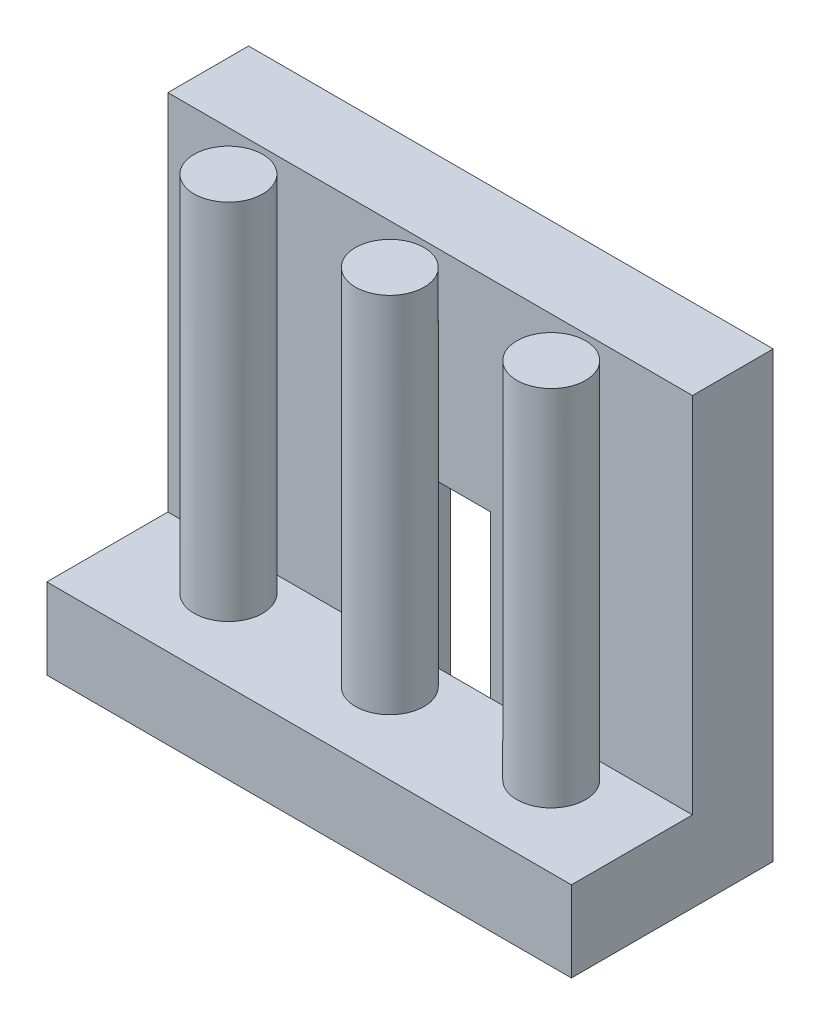
ISO-10303-21;
HEADER;
FILE_DESCRIPTION(('STEP AP214'),'2;1');
FILE_NAME('part.step','',(''),(''),'','','');
FILE_SCHEMA(('AUTOMOTIVE_DESIGN { 1 0 10303 214 1 1 1 1 }'));
ENDSEC;
DATA;
#1=APPLICATION_CONTEXT('core data for automotive mechanical design processes');
#2=APPLICATION_PROTOCOL_DEFINITION('international standard','automotive_design',2000,#1);
#3=PRODUCT_CONTEXT('',#1,'mechanical');
#4=PRODUCT('Part','Part','',(#3));
#5=PRODUCT_RELATED_PRODUCT_CATEGORY('part','',(#4));
#6=PRODUCT_DEFINITION_FORMATION('','',#4);
#7=PRODUCT_DEFINITION_CONTEXT('part definition',#1,'design');
#8=PRODUCT_DEFINITION('design','',#6,#7);
#9=PRODUCT_DEFINITION_SHAPE('','',#8);
#10=(LENGTH_UNIT() NAMED_UNIT(*) SI_UNIT(.MILLI.,.METRE.));
#11=(NAMED_UNIT(*) PLANE_ANGLE_UNIT() SI_UNIT($,.RADIAN.));
#12=(NAMED_UNIT(*) SI_UNIT($,.STERADIAN.) SOLID_ANGLE_UNIT());
#13=UNCERTAINTY_MEASURE_WITH_UNIT(LENGTH_MEASURE(1.E-05),#10,'distance_accuracy_value','');
#14=(GEOMETRIC_REPRESENTATION_CONTEXT(3) GLOBAL_UNCERTAINTY_ASSIGNED_CONTEXT((#13)) GLOBAL_UNIT_ASSIGNED_CONTEXT((#10,
#11,#12)) REPRESENTATION_CONTEXT('',''));
#15=CARTESIAN_POINT('',(0.,0.,0.));
#16=DIRECTION('',(0.,0.,1.));
#17=DIRECTION('',(1.,0.,0.));
#18=AXIS2_PLACEMENT_3D('',#15,#16,#17);
#19=CARTESIAN_POINT('',(0.,11.,0.));
#20=DIRECTION('',(1.,0.,0.));
#21=DIRECTION('',(0.,0.,-1.));
#22=AXIS2_PLACEMENT_3D('',#19,#20,#21);
#23=PLANE('',#22);
#24=DIRECTION('',(0.,0.,1.));
#25=VECTOR('',#24,1.);
#26=CARTESIAN_POINT('',(0.,2.,-3.));
#27=LINE('',#26,#25);
#28=CARTESIAN_POINT('',(0.,2.,-3.));
#29=VERTEX_POINT('',#28);
#30=CARTESIAN_POINT('',(0.,2.,0.));
#31=VERTEX_POINT('',#30);
#32=EDGE_CURVE('E186',#29,#31,#27,.T.);
#33=ORIENTED_EDGE('',*,*,#32,.F.);
#34=DIRECTION('',(0.,1.,0.));
#35=VECTOR('',#34,1.);
#36=CARTESIAN_POINT('',(0.,2.,-3.));
#37=LINE('',#36,#35);
#38=CARTESIAN_POINT('',(0.,11.,-3.));
#39=VERTEX_POINT('',#38);
#40=EDGE_CURVE('E196',#29,#39,#37,.T.);
#41=ORIENTED_EDGE('',*,*,#40,.T.);
#42=DIRECTION('',(0.,0.,1.));
#43=VECTOR('',#42,1.);
#44=CARTESIAN_POINT('',(0.,11.,0.));
#45=LINE('',#44,#43);
#46=CARTESIAN_POINT('',(0.,11.,-5.));
#47=VERTEX_POINT('',#46);
#48=EDGE_CURVE('E203',#47,#39,#45,.T.);
#49=ORIENTED_EDGE('',*,*,#48,.F.);
#50=DIRECTION('',(0.,-1.,0.));
#51=VECTOR('',#50,1.);
#52=CARTESIAN_POINT('',(0.,11.,-5.));
#53=LINE('',#52,#51);
#54=CARTESIAN_POINT('',(0.,0.,-5.));
#55=VERTEX_POINT('',#54);
#56=EDGE_CURVE('E214',#47,#55,#53,.T.);
#57=ORIENTED_EDGE('',*,*,#56,.T.);
#58=DIRECTION('',(0.,0.,1.));
#59=VECTOR('',#58,1.);
#60=CARTESIAN_POINT('',(0.,0.,0.));
#61=LINE('',#60,#59);
#62=CARTESIAN_POINT('',(0.,0.,0.));
#63=VERTEX_POINT('',#62);
#64=EDGE_CURVE('E200',#55,#63,#61,.T.);
#65=ORIENTED_EDGE('',*,*,#64,.T.);
#66=DIRECTION('',(0.,-1.,0.));
#67=VECTOR('',#66,1.);
#68=CARTESIAN_POINT('',(0.,11.,0.));
#69=LINE('',#68,#67);
#70=EDGE_CURVE('E239',#31,#63,#69,.T.);
#71=ORIENTED_EDGE('',*,*,#70,.F.);
#72=EDGE_LOOP('',(#33,#41,#49,#57,#65,#71));
#73=FACE_BOUND('',#72,.T.);
#74=ADVANCED_FACE('F39',(#73),#23,.F.);
#75=CARTESIAN_POINT('',(0.,11.,0.));
#76=DIRECTION('',(0.,0.,-1.));
#77=DIRECTION('',(-1.,0.,0.));
#78=AXIS2_PLACEMENT_3D('',#75,#76,#77);
#79=PLANE('',#78);
#80=DIRECTION('',(0.,-1.,0.));
#81=VECTOR('',#80,1.);
#82=CARTESIAN_POINT('',(13.,11.,0.));
#83=LINE('',#82,#81);
#84=CARTESIAN_POINT('',(13.,2.,0.));
#85=VERTEX_POINT('',#84);
#86=CARTESIAN_POINT('',(13.,0.,0.));
#87=VERTEX_POINT('',#86);
#88=EDGE_CURVE('E236',#85,#87,#83,.T.);
#89=ORIENTED_EDGE('',*,*,#88,.F.);
#90=DIRECTION('',(1.,0.,0.));
#91=VECTOR('',#90,1.);
#92=CARTESIAN_POINT('',(13.,2.,0.));
#93=LINE('',#92,#91);
#94=EDGE_CURVE('E190',#31,#85,#93,.T.);
#95=ORIENTED_EDGE('',*,*,#94,.F.);
#96=ORIENTED_EDGE('',*,*,#70,.T.);
#97=DIRECTION('',(1.,0.,0.));
#98=VECTOR('',#97,1.);
#99=CARTESIAN_POINT('',(0.,0.,0.));
#100=LINE('',#99,#98);
#101=EDGE_CURVE('E218',#63,#87,#100,.T.);
#102=ORIENTED_EDGE('',*,*,#101,.T.);
#103=EDGE_LOOP('',(#89,#95,#96,#102));
#104=FACE_BOUND('',#103,.T.);
#105=ADVANCED_FACE('F278',(#104),#79,.F.);
#106=CARTESIAN_POINT('',(13.,11.,0.));
#107=DIRECTION('',(-1.,0.,0.));
#108=DIRECTION('',(0.,0.,1.));
#109=AXIS2_PLACEMENT_3D('',#106,#107,#108);
#110=PLANE('',#109);
#111=DIRECTION('',(0.,0.,-1.));
#112=VECTOR('',#111,1.);
#113=CARTESIAN_POINT('',(13.,11.,0.));
#114=LINE('',#113,#112);
#115=CARTESIAN_POINT('',(13.,11.,-3.));
#116=VERTEX_POINT('',#115);
#117=CARTESIAN_POINT('',(13.,11.,-5.));
#118=VERTEX_POINT('',#117);
#119=EDGE_CURVE('E207',#116,#118,#114,.T.);
#120=ORIENTED_EDGE('',*,*,#119,.F.);
#121=DIRECTION('',(0.,1.,0.));
#122=VECTOR('',#121,1.);
#123=CARTESIAN_POINT('',(13.,2.,-3.));
#124=LINE('',#123,#122);
#125=CARTESIAN_POINT('',(13.,2.,-3.));
#126=VERTEX_POINT('',#125);
#127=EDGE_CURVE('E193',#126,#116,#124,.T.);
#128=ORIENTED_EDGE('',*,*,#127,.F.);
#129=DIRECTION('',(0.,0.,-1.));
#130=VECTOR('',#129,1.);
#131=CARTESIAN_POINT('',(13.,2.,-3.));
#132=LINE('',#131,#130);
#133=EDGE_CURVE('E178',#85,#126,#132,.T.);
#134=ORIENTED_EDGE('',*,*,#133,.F.);
#135=ORIENTED_EDGE('',*,*,#88,.T.);
#136=DIRECTION('',(0.,0.,-1.));
#137=VECTOR('',#136,1.);
#138=CARTESIAN_POINT('',(13.,0.,0.));
#139=LINE('',#138,#137);
#140=CARTESIAN_POINT('',(13.,0.,-5.));
#141=VERTEX_POINT('',#140);
#142=EDGE_CURVE('E222',#87,#141,#139,.T.);
#143=ORIENTED_EDGE('',*,*,#142,.T.);
#144=DIRECTION('',(0.,-1.,0.));
#145=VECTOR('',#144,1.);
#146=CARTESIAN_POINT('',(13.,11.,-5.));
#147=LINE('',#146,#145);
#148=EDGE_CURVE('E232',#118,#141,#147,.T.);
#149=ORIENTED_EDGE('',*,*,#148,.F.);
#150=EDGE_LOOP('',(#120,#128,#134,#135,#143,#149));
#151=FACE_BOUND('',#150,.T.);
#152=ADVANCED_FACE('F265',(#151),#110,.F.);
#153=CARTESIAN_POINT('',(0.,11.,-5.));
#154=DIRECTION('',(0.,0.,1.));
#155=DIRECTION('',(1.,0.,0.));
#156=AXIS2_PLACEMENT_3D('',#153,#154,#155);
#157=PLANE('',#156);
#158=DIRECTION('',(1.,0.,0.));
#159=VECTOR('',#158,1.);
#160=CARTESIAN_POINT('',(5.,6.,-5.));
#161=LINE('',#160,#159);
#162=CARTESIAN_POINT('',(5.,6.,-5.));
#163=VERTEX_POINT('',#162);
#164=CARTESIAN_POINT('',(8.,6.,-5.));
#165=VERTEX_POINT('',#164);
#166=EDGE_CURVE('E155',#163,#165,#161,.T.);
#167=ORIENTED_EDGE('',*,*,#166,.F.);
#168=DIRECTION('',(0.,1.,0.));
#169=VECTOR('',#168,1.);
#170=CARTESIAN_POINT('',(5.,6.,-5.));
#171=LINE('',#170,#169);
#172=CARTESIAN_POINT('',(5.,0.,-5.));
#173=VERTEX_POINT('',#172);
#174=EDGE_CURVE('E129',#173,#163,#171,.T.);
#175=ORIENTED_EDGE('',*,*,#174,.F.);
#176=DIRECTION('',(-1.,0.,0.));
#177=VECTOR('',#176,1.);
#178=CARTESIAN_POINT('',(0.,0.,-5.));
#179=LINE('',#178,#177);
#180=EDGE_CURVE('E225',#173,#55,#179,.T.);
#181=ORIENTED_EDGE('',*,*,#180,.T.);
#182=ORIENTED_EDGE('',*,*,#56,.F.);
#183=DIRECTION('',(-1.,0.,0.));
#184=VECTOR('',#183,1.);
#185=CARTESIAN_POINT('',(0.,11.,-5.));
#186=LINE('',#185,#184);
#187=EDGE_CURVE('E211',#118,#47,#186,.T.);
#188=ORIENTED_EDGE('',*,*,#187,.F.);
#189=ORIENTED_EDGE('',*,*,#148,.T.);
#190=CARTESIAN_POINT('',(8.,0.,-5.));
#191=VERTEX_POINT('',#190);
#192=EDGE_CURVE('E208',#141,#191,#179,.T.);
#193=ORIENTED_EDGE('',*,*,#192,.T.);
#194=DIRECTION('',(0.,-1.,0.));
#195=VECTOR('',#194,1.);
#196=CARTESIAN_POINT('',(8.,6.,-5.));
#197=LINE('',#196,#195);
#198=EDGE_CURVE('E151',#165,#191,#197,.T.);
#199=ORIENTED_EDGE('',*,*,#198,.F.);
#200=EDGE_LOOP('',(#167,#175,#181,#182,#188,#189,#193,#199));
#201=FACE_BOUND('',#200,.T.);
#202=ADVANCED_FACE('F284',(#201),#157,.F.);
#203=CARTESIAN_POINT('',(0.,11.,0.));
#204=DIRECTION('',(0.,-1.,0.));
#205=DIRECTION('',(0.,0.,-1.));
#206=AXIS2_PLACEMENT_3D('',#203,#204,#205);
#207=PLANE('',#206);
#208=ORIENTED_EDGE('',*,*,#48,.T.);
#209=DIRECTION('',(-1.,0.,0.));
#210=VECTOR('',#209,1.);
#211=CARTESIAN_POINT('',(13.,11.,-3.));
#212=LINE('',#211,#210);
#213=EDGE_CURVE('E173',#116,#39,#212,.T.);
#214=ORIENTED_EDGE('',*,*,#213,.F.);
#215=ORIENTED_EDGE('',*,*,#119,.T.);
#216=ORIENTED_EDGE('',*,*,#187,.T.);
#217=EDGE_LOOP('',(#208,#214,#215,#216));
#218=FACE_BOUND('',#217,.T.);
#219=ADVANCED_FACE('F269',(#218),#207,.F.);
#220=CARTESIAN_POINT('',(0.,0.,0.));
#221=DIRECTION('',(0.,-1.,0.));
#222=DIRECTION('',(0.,0.,-1.));
#223=AXIS2_PLACEMENT_3D('',#220,#221,#222);
#224=PLANE('',#223);
#225=DIRECTION('',(0.,0.,-1.));
#226=VECTOR('',#225,1.);
#227=CARTESIAN_POINT('',(5.,0.,-3.));
#228=LINE('',#227,#226);
#229=CARTESIAN_POINT('',(5.,0.,-3.));
#230=VERTEX_POINT('',#229);
#231=EDGE_CURVE('E170',#230,#173,#228,.T.);
#232=ORIENTED_EDGE('',*,*,#231,.F.);
#233=DIRECTION('',(-1.,0.,0.));
#234=VECTOR('',#233,1.);
#235=CARTESIAN_POINT('',(5.,0.,-3.));
#236=LINE('',#235,#234);
#237=CARTESIAN_POINT('',(8.,0.,-3.));
#238=VERTEX_POINT('',#237);
#239=EDGE_CURVE('E135',#238,#230,#236,.T.);
#240=ORIENTED_EDGE('',*,*,#239,.F.);
#241=DIRECTION('',(0.,0.,-1.));
#242=VECTOR('',#241,1.);
#243=CARTESIAN_POINT('',(8.,0.,-3.));
#244=LINE('',#243,#242);
#245=EDGE_CURVE('E54',#238,#191,#244,.T.);
#246=ORIENTED_EDGE('',*,*,#245,.T.);
#247=ORIENTED_EDGE('',*,*,#192,.F.);
#248=ORIENTED_EDGE('',*,*,#142,.F.);
#249=ORIENTED_EDGE('',*,*,#101,.F.);
#250=ORIENTED_EDGE('',*,*,#64,.F.);
#251=ORIENTED_EDGE('',*,*,#180,.F.);
#252=EDGE_LOOP('',(#232,#240,#246,#247,#248,#249,#250,#251));
#253=FACE_BOUND('',#252,.T.);
#254=ADVANCED_FACE('F287',(#253),#224,.T.);
#255=CARTESIAN_POINT('',(13.,2.,-3.));
#256=DIRECTION('',(0.,0.,-1.));
#257=DIRECTION('',(-1.,0.,0.));
#258=AXIS2_PLACEMENT_3D('',#255,#256,#257);
#259=PLANE('',#258);
#260=DIRECTION('',(-1.,0.,0.));
#261=VECTOR('',#260,1.);
#262=CARTESIAN_POINT('',(13.,2.,-3.));
#263=LINE('',#262,#261);
#264=CARTESIAN_POINT('',(5.,2.,-3.));
#265=VERTEX_POINT('',#264);
#266=EDGE_CURVE('E148',#265,#29,#263,.T.);
#267=ORIENTED_EDGE('',*,*,#266,.F.);
#268=DIRECTION('',(0.,1.,0.));
#269=VECTOR('',#268,1.);
#270=CARTESIAN_POINT('',(5.,6.,-3.));
#271=LINE('',#270,#269);
#272=CARTESIAN_POINT('',(5.,6.,-3.));
#273=VERTEX_POINT('',#272);
#274=EDGE_CURVE('E126',#265,#273,#271,.T.);
#275=ORIENTED_EDGE('',*,*,#274,.T.);
#276=DIRECTION('',(1.,0.,0.));
#277=VECTOR('',#276,1.);
#278=CARTESIAN_POINT('',(5.,6.,-3.));
#279=LINE('',#278,#277);
#280=CARTESIAN_POINT('',(8.,6.,-3.));
#281=VERTEX_POINT('',#280);
#282=EDGE_CURVE('E138',#273,#281,#279,.T.);
#283=ORIENTED_EDGE('',*,*,#282,.T.);
#284=DIRECTION('',(0.,-1.,0.));
#285=VECTOR('',#284,1.);
#286=CARTESIAN_POINT('',(8.,6.,-3.));
#287=LINE('',#286,#285);
#288=CARTESIAN_POINT('',(8.,2.,-3.));
#289=VERTEX_POINT('',#288);
#290=EDGE_CURVE('E161',#281,#289,#287,.T.);
#291=ORIENTED_EDGE('',*,*,#290,.T.);
#292=EDGE_CURVE('E182',#126,#289,#263,.T.);
#293=ORIENTED_EDGE('',*,*,#292,.F.);
#294=ORIENTED_EDGE('',*,*,#127,.T.);
#295=ORIENTED_EDGE('',*,*,#213,.T.);
#296=ORIENTED_EDGE('',*,*,#40,.F.);
#297=EDGE_LOOP('',(#267,#275,#283,#291,#293,#294,#295,#296));
#298=FACE_BOUND('',#297,.T.);
#299=ADVANCED_FACE('F146',(#298),#259,.F.);
#300=CARTESIAN_POINT('',(0.,2.,0.));
#301=DIRECTION('',(0.,-1.,0.));
#302=DIRECTION('',(0.,0.,-1.));
#303=AXIS2_PLACEMENT_3D('',#300,#301,#302);
#304=PLANE('',#303);
#305=CARTESIAN_POINT('',(2.5,2.,-2.));
#306=DIRECTION('',(0.,-1.,0.));
#307=DIRECTION('',(0.,0.,-1.));
#308=AXIS2_PLACEMENT_3D('',#305,#306,#307);
#309=CIRCLE('',#308,0.85);
#310=CARTESIAN_POINT('',(2.5,2.,-2.85));
#311=VERTEX_POINT('',#310);
#312=EDGE_CURVE('E11',#311,#311,#309,.F.);
#313=ORIENTED_EDGE('',*,*,#312,.F.);
#314=EDGE_LOOP('',(#313));
#315=FACE_BOUND('',#314,.T.);
#316=CARTESIAN_POINT('',(6.5,2.,-2.));
#317=DIRECTION('',(0.,-1.,0.));
#318=DIRECTION('',(0.,0.,-1.));
#319=AXIS2_PLACEMENT_3D('',#316,#317,#318);
#320=CIRCLE('',#319,0.849999999999998);
#321=CARTESIAN_POINT('',(6.5,2.,-2.85));
#322=VERTEX_POINT('',#321);
#323=EDGE_CURVE('E47',#322,#322,#320,.F.);
#324=ORIENTED_EDGE('',*,*,#323,.F.);
#325=EDGE_LOOP('',(#324));
#326=FACE_BOUND('',#325,.T.);
#327=CARTESIAN_POINT('',(10.5,2.,-2.));
#328=DIRECTION('',(0.,-1.,0.));
#329=DIRECTION('',(0.,0.,-1.));
#330=AXIS2_PLACEMENT_3D('',#327,#328,#329);
#331=CIRCLE('',#330,0.85);
#332=CARTESIAN_POINT('',(10.5,2.,-2.85));
#333=VERTEX_POINT('',#332);
#334=EDGE_CURVE('E242',#333,#333,#331,.F.);
#335=ORIENTED_EDGE('',*,*,#334,.F.);
#336=EDGE_LOOP('',(#335));
#337=FACE_BOUND('',#336,.T.);
#338=ORIENTED_EDGE('',*,*,#133,.T.);
#339=ORIENTED_EDGE('',*,*,#292,.T.);
#340=EDGE_CURVE('E187',#289,#265,#263,.T.);
#341=ORIENTED_EDGE('',*,*,#340,.T.);
#342=ORIENTED_EDGE('',*,*,#266,.T.);
#343=ORIENTED_EDGE('',*,*,#32,.T.);
#344=ORIENTED_EDGE('',*,*,#94,.T.);
#345=EDGE_LOOP('',(#338,#339,#341,#342,#343,#344));
#346=FACE_BOUND('',#345,.T.);
#347=ADVANCED_FACE('F251',(#315,#326,#337,#346),#304,.F.);
#348=CARTESIAN_POINT('',(0.,0.,-3.));
#349=DIRECTION('',(0.,0.,1.));
#350=DIRECTION('',(1.,0.,0.));
#351=AXIS2_PLACEMENT_3D('',#348,#349,#350);
#352=PLANE('',#351);
#353=EDGE_CURVE('E144',#289,#238,#287,.T.);
#354=ORIENTED_EDGE('',*,*,#353,.T.);
#355=ORIENTED_EDGE('',*,*,#239,.T.);
#356=EDGE_CURVE('E62',#230,#265,#271,.T.);
#357=ORIENTED_EDGE('',*,*,#356,.T.);
#358=ORIENTED_EDGE('',*,*,#340,.F.);
#359=EDGE_LOOP('',(#354,#355,#357,#358));
#360=FACE_BOUND('',#359,.T.);
#361=ADVANCED_FACE('F254',(#360),#352,.F.);
#362=CARTESIAN_POINT('',(5.,6.,-3.));
#363=DIRECTION('',(-1.,0.,0.));
#364=DIRECTION('',(0.,0.,1.));
#365=AXIS2_PLACEMENT_3D('',#362,#363,#364);
#366=PLANE('',#365);
#367=ORIENTED_EDGE('',*,*,#174,.T.);
#368=DIRECTION('',(0.,0.,-1.));
#369=VECTOR('',#368,1.);
#370=CARTESIAN_POINT('',(5.,6.,-3.));
#371=LINE('',#370,#369);
#372=EDGE_CURVE('E122',#273,#163,#371,.T.);
#373=ORIENTED_EDGE('',*,*,#372,.F.);
#374=ORIENTED_EDGE('',*,*,#274,.F.);
#375=ORIENTED_EDGE('',*,*,#356,.F.);
#376=ORIENTED_EDGE('',*,*,#231,.T.);
#377=EDGE_LOOP('',(#367,#373,#374,#375,#376));
#378=FACE_BOUND('',#377,.T.);
#379=ADVANCED_FACE('F124',(#378),#366,.F.);
#380=CARTESIAN_POINT('',(8.,6.,-3.));
#381=DIRECTION('',(1.,0.,0.));
#382=DIRECTION('',(0.,0.,-1.));
#383=AXIS2_PLACEMENT_3D('',#380,#381,#382);
#384=PLANE('',#383);
#385=ORIENTED_EDGE('',*,*,#198,.T.);
#386=ORIENTED_EDGE('',*,*,#245,.F.);
#387=ORIENTED_EDGE('',*,*,#353,.F.);
#388=ORIENTED_EDGE('',*,*,#290,.F.);
#389=DIRECTION('',(0.,0.,-1.));
#390=VECTOR('',#389,1.);
#391=CARTESIAN_POINT('',(8.,6.,-3.));
#392=LINE('',#391,#390);
#393=EDGE_CURVE('E134',#281,#165,#392,.T.);
#394=ORIENTED_EDGE('',*,*,#393,.T.);
#395=EDGE_LOOP('',(#385,#386,#387,#388,#394));
#396=FACE_BOUND('',#395,.T.);
#397=ADVANCED_FACE('F294',(#396),#384,.F.);
#398=CARTESIAN_POINT('',(5.,6.,-3.));
#399=DIRECTION('',(0.,1.,0.));
#400=DIRECTION('',(0.,0.,1.));
#401=AXIS2_PLACEMENT_3D('',#398,#399,#400);
#402=PLANE('',#401);
#403=ORIENTED_EDGE('',*,*,#166,.T.);
#404=ORIENTED_EDGE('',*,*,#393,.F.);
#405=ORIENTED_EDGE('',*,*,#282,.F.);
#406=ORIENTED_EDGE('',*,*,#372,.T.);
#407=EDGE_LOOP('',(#403,#404,#405,#406));
#408=FACE_BOUND('',#407,.T.);
#409=ADVANCED_FACE('F139',(#408),#402,.F.);
#410=CARTESIAN_POINT('',(10.5,11.,-2.));
#411=DIRECTION('',(0.,-1.,0.));
#412=DIRECTION('',(0.,0.,-1.));
#413=AXIS2_PLACEMENT_3D('',#410,#411,#412);
#414=CYLINDRICAL_SURFACE('',#413,0.85);
#415=CARTESIAN_POINT('',(10.5,11.,-2.));
#416=DIRECTION('',(0.,1.,0.));
#417=DIRECTION('',(0.,0.,1.));
#418=AXIS2_PLACEMENT_3D('',#415,#416,#417);
#419=CIRCLE('',#418,0.85);
#420=CARTESIAN_POINT('',(10.5,11.,-1.15));
#421=VERTEX_POINT('',#420);
#422=EDGE_CURVE('E158',#421,#421,#419,.T.);
#423=ORIENTED_EDGE('',*,*,#422,.F.);
#424=EDGE_LOOP('',(#423));
#425=FACE_BOUND('',#424,.T.);
#426=ORIENTED_EDGE('',*,*,#334,.T.);
#427=EDGE_LOOP('',(#426));
#428=FACE_BOUND('',#427,.T.);
#429=ADVANCED_FACE('F301',(#425,#428),#414,.T.);
#430=CARTESIAN_POINT('',(10.5,11.,-2.));
#431=DIRECTION('',(0.,1.,0.));
#432=DIRECTION('',(0.,0.,1.));
#433=AXIS2_PLACEMENT_3D('',#430,#431,#432);
#434=PLANE('',#433);
#435=ORIENTED_EDGE('',*,*,#422,.T.);
#436=EDGE_LOOP('',(#435));
#437=FACE_BOUND('',#436,.T.);
#438=ADVANCED_FACE('F357',(#437),#434,.T.);
#439=CARTESIAN_POINT('',(6.5,11.,-2.));
#440=DIRECTION('',(0.,-1.,0.));
#441=DIRECTION('',(0.,0.,-1.));
#442=AXIS2_PLACEMENT_3D('',#439,#440,#441);
#443=CYLINDRICAL_SURFACE('',#442,0.849999999999998);
#444=CARTESIAN_POINT('',(6.5,11.,-2.));
#445=DIRECTION('',(0.,1.,0.));
#446=DIRECTION('',(0.,0.,1.));
#447=AXIS2_PLACEMENT_3D('',#444,#445,#446);
#448=CIRCLE('',#447,0.849999999999998);
#449=CARTESIAN_POINT('',(6.5,11.,-1.15));
#450=VERTEX_POINT('',#449);
#451=EDGE_CURVE('E414',#450,#450,#448,.T.);
#452=ORIENTED_EDGE('',*,*,#451,.F.);
#453=EDGE_LOOP('',(#452));
#454=FACE_BOUND('',#453,.T.);
#455=ORIENTED_EDGE('',*,*,#323,.T.);
#456=EDGE_LOOP('',(#455));
#457=FACE_BOUND('',#456,.T.);
#458=ADVANCED_FACE('F249',(#454,#457),#443,.T.);
#459=CARTESIAN_POINT('',(6.5,11.,-2.));
#460=DIRECTION('',(0.,1.,0.));
#461=DIRECTION('',(0.,0.,1.));
#462=AXIS2_PLACEMENT_3D('',#459,#460,#461);
#463=PLANE('',#462);
#464=ORIENTED_EDGE('',*,*,#451,.T.);
#465=EDGE_LOOP('',(#464));
#466=FACE_BOUND('',#465,.T.);
#467=ADVANCED_FACE('F371',(#466),#463,.T.);
#468=CARTESIAN_POINT('',(2.5,11.,-2.));
#469=DIRECTION('',(0.,-1.,0.));
#470=DIRECTION('',(0.,0.,-1.));
#471=AXIS2_PLACEMENT_3D('',#468,#469,#470);
#472=CYLINDRICAL_SURFACE('',#471,0.85);
#473=CARTESIAN_POINT('',(2.5,11.,-2.));
#474=DIRECTION('',(0.,1.,0.));
#475=DIRECTION('',(0.,0.,1.));
#476=AXIS2_PLACEMENT_3D('',#473,#474,#475);
#477=CIRCLE('',#476,0.85);
#478=CARTESIAN_POINT('',(2.5,11.,-1.15));
#479=VERTEX_POINT('',#478);
#480=EDGE_CURVE('E412',#479,#479,#477,.T.);
#481=ORIENTED_EDGE('',*,*,#480,.F.);
#482=EDGE_LOOP('',(#481));
#483=FACE_BOUND('',#482,.T.);
#484=ORIENTED_EDGE('',*,*,#312,.T.);
#485=EDGE_LOOP('',(#484));
#486=FACE_BOUND('',#485,.T.);
#487=ADVANCED_FACE('F379',(#483,#486),#472,.T.);
#488=CARTESIAN_POINT('',(2.5,11.,-2.));
#489=DIRECTION('',(0.,1.,0.));
#490=DIRECTION('',(0.,0.,1.));
#491=AXIS2_PLACEMENT_3D('',#488,#489,#490);
#492=PLANE('',#491);
#493=ORIENTED_EDGE('',*,*,#480,.T.);
#494=EDGE_LOOP('',(#493));
#495=FACE_BOUND('',#494,.T.);
#496=ADVANCED_FACE('F387',(#495),#492,.T.);
#497=CLOSED_SHELL('',(#74,#105,#152,#202,#219,#254,#299,#347,#361,#379,#397,#409,#429,#438,#458,
#467,#487,#496));
#498=MANIFOLD_SOLID_BREP('B2',#497);
#499=ADVANCED_BREP_SHAPE_REPRESENTATION('',(#18,#498),#14);
#500=SHAPE_DEFINITION_REPRESENTATION(#9,#499);
ENDSEC;
END-ISO-10303-21;
